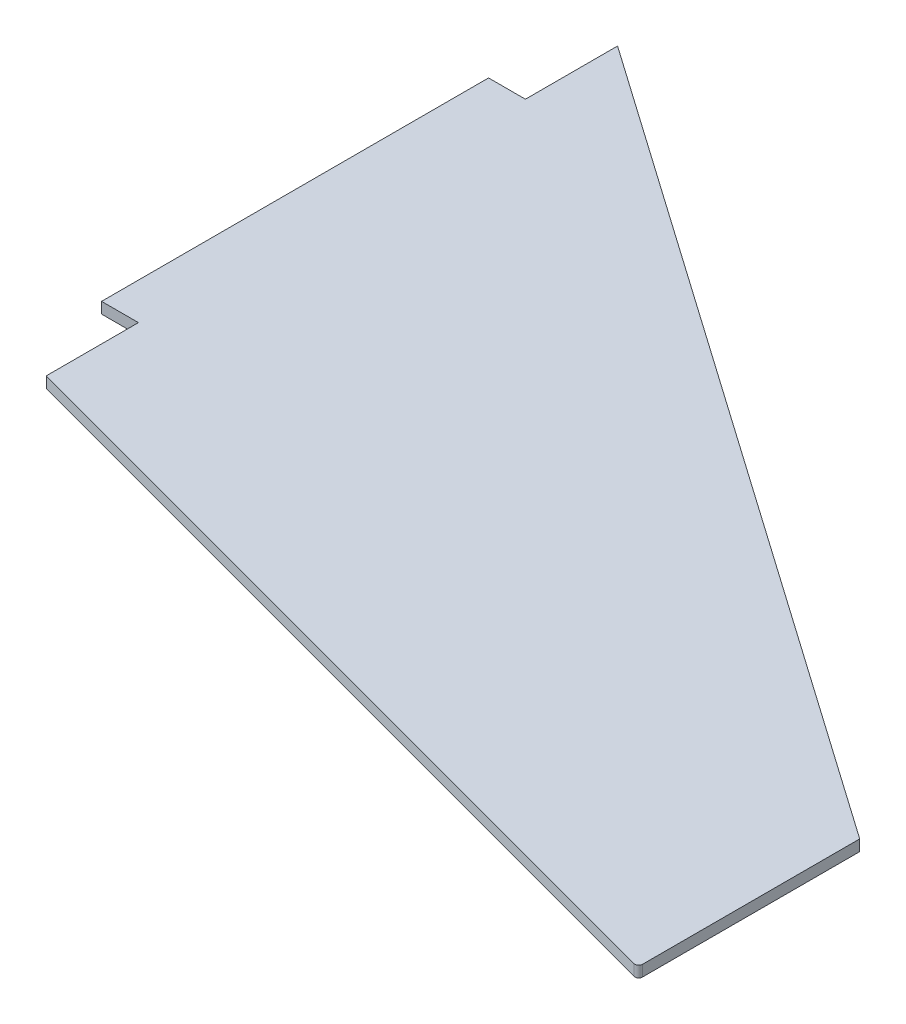
ISO-10303-21;
HEADER;
FILE_DESCRIPTION(('STEP AP214'),'2;1');
FILE_NAME('part.step','',(''),(''),'','','');
FILE_SCHEMA(('AUTOMOTIVE_DESIGN { 1 0 10303 214 1 1 1 1 }'));
ENDSEC;
DATA;
#1=APPLICATION_CONTEXT('core data for automotive mechanical design processes');
#2=APPLICATION_PROTOCOL_DEFINITION('international standard','automotive_design',2000,#1);
#3=PRODUCT_CONTEXT('',#1,'mechanical');
#4=PRODUCT('Part','Part','',(#3));
#5=PRODUCT_RELATED_PRODUCT_CATEGORY('part','',(#4));
#6=PRODUCT_DEFINITION_FORMATION('','',#4);
#7=PRODUCT_DEFINITION_CONTEXT('part definition',#1,'design');
#8=PRODUCT_DEFINITION('design','',#6,#7);
#9=PRODUCT_DEFINITION_SHAPE('','',#8);
#10=(LENGTH_UNIT() NAMED_UNIT(*) SI_UNIT(.MILLI.,.METRE.));
#11=(NAMED_UNIT(*) PLANE_ANGLE_UNIT() SI_UNIT($,.RADIAN.));
#12=(NAMED_UNIT(*) SI_UNIT($,.STERADIAN.) SOLID_ANGLE_UNIT());
#13=UNCERTAINTY_MEASURE_WITH_UNIT(LENGTH_MEASURE(1.E-05),#10,'distance_accuracy_value','');
#14=(GEOMETRIC_REPRESENTATION_CONTEXT(3) GLOBAL_UNCERTAINTY_ASSIGNED_CONTEXT((#13)) GLOBAL_UNIT_ASSIGNED_CONTEXT((#10,
#11,#12)) REPRESENTATION_CONTEXT('',''));
#15=CARTESIAN_POINT('',(0.,0.,0.));
#16=DIRECTION('',(0.,0.,1.));
#17=DIRECTION('',(1.,0.,0.));
#18=AXIS2_PLACEMENT_3D('',#15,#16,#17);
#19=CARTESIAN_POINT('',(0.,3.,0.));
#20=DIRECTION('',(1.,0.,0.));
#21=DIRECTION('',(0.,0.,-1.));
#22=AXIS2_PLACEMENT_3D('',#19,#20,#21);
#23=PLANE('',#22);
#24=DIRECTION('',(0.,0.,1.));
#25=VECTOR('',#24,1.);
#26=CARTESIAN_POINT('',(0.,0.,0.));
#27=LINE('',#26,#25);
#28=CARTESIAN_POINT('',(0.,0.,-25.));
#29=VERTEX_POINT('',#28);
#30=CARTESIAN_POINT('',(0.,0.,0.));
#31=VERTEX_POINT('',#30);
#32=EDGE_CURVE('E152',#29,#31,#27,.T.);
#33=ORIENTED_EDGE('',*,*,#32,.T.);
#34=DIRECTION('',(0.,-1.,0.));
#35=VECTOR('',#34,1.);
#36=CARTESIAN_POINT('',(0.,3.,0.));
#37=LINE('',#36,#35);
#38=CARTESIAN_POINT('',(0.,3.,0.));
#39=VERTEX_POINT('',#38);
#40=EDGE_CURVE('E11',#39,#31,#37,.T.);
#41=ORIENTED_EDGE('',*,*,#40,.F.);
#42=DIRECTION('',(0.,0.,1.));
#43=VECTOR('',#42,1.);
#44=CARTESIAN_POINT('',(0.,3.,0.));
#45=LINE('',#44,#43);
#46=CARTESIAN_POINT('',(0.,3.,-25.));
#47=VERTEX_POINT('',#46);
#48=EDGE_CURVE('E177',#47,#39,#45,.T.);
#49=ORIENTED_EDGE('',*,*,#48,.F.);
#50=DIRECTION('',(0.,-1.,0.));
#51=VECTOR('',#50,1.);
#52=CARTESIAN_POINT('',(0.,3.,-25.));
#53=LINE('',#52,#51);
#54=EDGE_CURVE('E148',#47,#29,#53,.T.);
#55=ORIENTED_EDGE('',*,*,#54,.T.);
#56=EDGE_LOOP('',(#33,#41,#49,#55));
#57=FACE_BOUND('',#56,.T.);
#58=ADVANCED_FACE('F45',(#57),#23,.F.);
#59=CARTESIAN_POINT('',(0.,3.,0.));
#60=DIRECTION('',(0.,0.,1.));
#61=DIRECTION('',(1.,0.,0.));
#62=AXIS2_PLACEMENT_3D('',#59,#60,#61);
#63=PLANE('',#62);
#64=DIRECTION('',(-1.,0.,0.));
#65=VECTOR('',#64,1.);
#66=CARTESIAN_POINT('',(0.,0.,0.));
#67=LINE('',#66,#65);
#68=CARTESIAN_POINT('',(-10.,0.,0.));
#69=VERTEX_POINT('',#68);
#70=EDGE_CURVE('E156',#31,#69,#67,.T.);
#71=ORIENTED_EDGE('',*,*,#70,.T.);
#72=DIRECTION('',(0.,-1.,0.));
#73=VECTOR('',#72,1.);
#74=CARTESIAN_POINT('',(-10.,3.,0.));
#75=LINE('',#74,#73);
#76=CARTESIAN_POINT('',(-10.,3.,0.));
#77=VERTEX_POINT('',#76);
#78=EDGE_CURVE('E54',#77,#69,#75,.T.);
#79=ORIENTED_EDGE('',*,*,#78,.F.);
#80=DIRECTION('',(-1.,0.,0.));
#81=VECTOR('',#80,1.);
#82=CARTESIAN_POINT('',(0.,3.,0.));
#83=LINE('',#82,#81);
#84=EDGE_CURVE('E108',#39,#77,#83,.T.);
#85=ORIENTED_EDGE('',*,*,#84,.F.);
#86=ORIENTED_EDGE('',*,*,#40,.T.);
#87=EDGE_LOOP('',(#71,#79,#85,#86));
#88=FACE_BOUND('',#87,.T.);
#89=ADVANCED_FACE('F233',(#88),#63,.F.);
#90=CARTESIAN_POINT('',(-10.,3.,0.));
#91=DIRECTION('',(1.,0.,0.));
#92=DIRECTION('',(0.,0.,-1.));
#93=AXIS2_PLACEMENT_3D('',#90,#91,#92);
#94=PLANE('',#93);
#95=DIRECTION('',(0.,0.,1.));
#96=VECTOR('',#95,1.);
#97=CARTESIAN_POINT('',(-10.,0.,0.));
#98=LINE('',#97,#96);
#99=CARTESIAN_POINT('',(-9.99999999999999,0.,105.));
#100=VERTEX_POINT('',#99);
#101=EDGE_CURVE('E159',#69,#100,#98,.T.);
#102=ORIENTED_EDGE('',*,*,#101,.T.);
#103=DIRECTION('',(0.,-1.,0.));
#104=VECTOR('',#103,1.);
#105=CARTESIAN_POINT('',(-9.99999999999999,3.,105.));
#106=LINE('',#105,#104);
#107=CARTESIAN_POINT('',(-9.99999999999999,3.,105.));
#108=VERTEX_POINT('',#107);
#109=EDGE_CURVE('E192',#108,#100,#106,.T.);
#110=ORIENTED_EDGE('',*,*,#109,.F.);
#111=DIRECTION('',(0.,0.,1.));
#112=VECTOR('',#111,1.);
#113=CARTESIAN_POINT('',(-10.,3.,0.));
#114=LINE('',#113,#112);
#115=EDGE_CURVE('E202',#77,#108,#114,.T.);
#116=ORIENTED_EDGE('',*,*,#115,.F.);
#117=ORIENTED_EDGE('',*,*,#78,.T.);
#118=EDGE_LOOP('',(#102,#110,#116,#117));
#119=FACE_BOUND('',#118,.T.);
#120=ADVANCED_FACE('F200',(#119),#94,.F.);
#121=CARTESIAN_POINT('',(0.,3.,105.));
#122=DIRECTION('',(0.,0.,-1.));
#123=DIRECTION('',(-1.,0.,0.));
#124=AXIS2_PLACEMENT_3D('',#121,#122,#123);
#125=PLANE('',#124);
#126=DIRECTION('',(1.,0.,0.));
#127=VECTOR('',#126,1.);
#128=CARTESIAN_POINT('',(0.,0.,105.));
#129=LINE('',#128,#127);
#130=CARTESIAN_POINT('',(0.,0.,105.));
#131=VERTEX_POINT('',#130);
#132=EDGE_CURVE('E162',#100,#131,#129,.T.);
#133=ORIENTED_EDGE('',*,*,#132,.T.);
#134=DIRECTION('',(0.,-1.,0.));
#135=VECTOR('',#134,1.);
#136=CARTESIAN_POINT('',(0.,3.,105.));
#137=LINE('',#136,#135);
#138=CARTESIAN_POINT('',(0.,3.,105.));
#139=VERTEX_POINT('',#138);
#140=EDGE_CURVE('E188',#139,#131,#137,.T.);
#141=ORIENTED_EDGE('',*,*,#140,.F.);
#142=DIRECTION('',(1.,0.,0.));
#143=VECTOR('',#142,1.);
#144=CARTESIAN_POINT('',(0.,3.,105.));
#145=LINE('',#144,#143);
#146=EDGE_CURVE('E219',#108,#139,#145,.T.);
#147=ORIENTED_EDGE('',*,*,#146,.F.);
#148=ORIENTED_EDGE('',*,*,#109,.T.);
#149=EDGE_LOOP('',(#133,#141,#147,#148));
#150=FACE_BOUND('',#149,.T.);
#151=ADVANCED_FACE('F211',(#150),#125,.F.);
#152=CARTESIAN_POINT('',(0.,3.,130.));
#153=DIRECTION('',(1.,0.,0.));
#154=DIRECTION('',(0.,0.,-1.));
#155=AXIS2_PLACEMENT_3D('',#152,#153,#154);
#156=PLANE('',#155);
#157=DIRECTION('',(0.,0.,1.));
#158=VECTOR('',#157,1.);
#159=CARTESIAN_POINT('',(0.,0.,130.));
#160=LINE('',#159,#158);
#161=CARTESIAN_POINT('',(0.,0.,130.));
#162=VERTEX_POINT('',#161);
#163=EDGE_CURVE('E165',#131,#162,#160,.T.);
#164=ORIENTED_EDGE('',*,*,#163,.T.);
#165=DIRECTION('',(0.,-1.,0.));
#166=VECTOR('',#165,1.);
#167=CARTESIAN_POINT('',(0.,3.,130.));
#168=LINE('',#167,#166);
#169=CARTESIAN_POINT('',(0.,3.,130.));
#170=VERTEX_POINT('',#169);
#171=EDGE_CURVE('E184',#170,#162,#168,.T.);
#172=ORIENTED_EDGE('',*,*,#171,.F.);
#173=DIRECTION('',(0.,0.,1.));
#174=VECTOR('',#173,1.);
#175=CARTESIAN_POINT('',(0.,3.,130.));
#176=LINE('',#175,#174);
#177=EDGE_CURVE('E217',#139,#170,#176,.T.);
#178=ORIENTED_EDGE('',*,*,#177,.F.);
#179=ORIENTED_EDGE('',*,*,#140,.T.);
#180=EDGE_LOOP('',(#164,#172,#178,#179));
#181=FACE_BOUND('',#180,.T.);
#182=ADVANCED_FACE('F215',(#181),#156,.F.);
#183=CARTESIAN_POINT('',(217.903180954897,3.,188.386981365037));
#184=DIRECTION('',(0.258819045102518,0.,-0.965925826289069));
#185=DIRECTION('',(-0.965925826289069,0.,-0.258819045102518));
#186=AXIS2_PLACEMENT_3D('',#183,#184,#185);
#187=PLANE('',#186);
#188=DIRECTION('',(0.965925826289069,0.,0.258819045102518));
#189=VECTOR('',#188,1.);
#190=CARTESIAN_POINT('',(217.903180954897,0.,188.386981365037));
#191=LINE('',#190,#189);
#192=CARTESIAN_POINT('',(217.903180954897,0.,188.386981365037));
#193=VERTEX_POINT('',#192);
#194=EDGE_CURVE('E168',#162,#193,#191,.T.);
#195=ORIENTED_EDGE('',*,*,#194,.T.);
#196=DIRECTION('',(0.,-1.,0.));
#197=VECTOR('',#196,1.);
#198=CARTESIAN_POINT('',(217.903180954897,3.,188.386981365037));
#199=LINE('',#198,#197);
#200=CARTESIAN_POINT('',(217.903180954897,3.,188.386981365037));
#201=VERTEX_POINT('',#200);
#202=EDGE_CURVE('E141',#201,#193,#199,.T.);
#203=ORIENTED_EDGE('',*,*,#202,.F.);
#204=DIRECTION('',(0.965925826289069,0.,0.258819045102518));
#205=VECTOR('',#204,1.);
#206=CARTESIAN_POINT('',(217.903180954897,3.,188.386981365037));
#207=LINE('',#206,#205);
#208=EDGE_CURVE('E130',#170,#201,#207,.T.);
#209=ORIENTED_EDGE('',*,*,#208,.F.);
#210=ORIENTED_EDGE('',*,*,#171,.T.);
#211=EDGE_LOOP('',(#195,#203,#209,#210));
#212=FACE_BOUND('',#211,.T.);
#213=ADVANCED_FACE('F245',(#212),#187,.F.);
#214=CARTESIAN_POINT('',(218.162,3.,187.421055538748));
#215=DIRECTION('',(0.,-1.,0.));
#216=DIRECTION('',(0.,0.,-1.));
#217=AXIS2_PLACEMENT_3D('',#214,#215,#216);
#218=CYLINDRICAL_SURFACE('',#217,1.00000000000002);
#219=CARTESIAN_POINT('',(218.162,0.,187.421055538748));
#220=DIRECTION('',(0.,1.,0.));
#221=DIRECTION('',(0.,0.,-1.));
#222=AXIS2_PLACEMENT_3D('',#219,#220,#221);
#223=CIRCLE('',#222,1.00000000000002);
#224=CARTESIAN_POINT('',(219.162,0.,187.421055538748));
#225=VERTEX_POINT('',#224);
#226=EDGE_CURVE('E139',#193,#225,#223,.T.);
#227=ORIENTED_EDGE('',*,*,#226,.T.);
#228=DIRECTION('',(0.,-1.,0.));
#229=VECTOR('',#228,1.);
#230=CARTESIAN_POINT('',(219.162,3.,187.421055538748));
#231=LINE('',#230,#229);
#232=CARTESIAN_POINT('',(219.162,3.,187.421055538748));
#233=VERTEX_POINT('',#232);
#234=EDGE_CURVE('E136',#233,#225,#231,.T.);
#235=ORIENTED_EDGE('',*,*,#234,.F.);
#236=CARTESIAN_POINT('',(218.162,3.,187.421055538748));
#237=DIRECTION('',(0.,1.,0.));
#238=DIRECTION('',(0.,0.,-1.));
#239=AXIS2_PLACEMENT_3D('',#236,#237,#238);
#240=CIRCLE('',#239,1.00000000000002);
#241=EDGE_CURVE('E124',#201,#233,#240,.T.);
#242=ORIENTED_EDGE('',*,*,#241,.F.);
#243=ORIENTED_EDGE('',*,*,#202,.T.);
#244=EDGE_LOOP('',(#227,#235,#242,#243));
#245=FACE_BOUND('',#244,.T.);
#246=ADVANCED_FACE('F137',(#245),#218,.T.);
#247=CARTESIAN_POINT('',(219.162,3.,187.421055538748));
#248=DIRECTION('',(-1.,0.,0.));
#249=DIRECTION('',(0.,0.,1.));
#250=AXIS2_PLACEMENT_3D('',#247,#248,#249);
#251=PLANE('',#250);
#252=DIRECTION('',(0.,0.,-1.));
#253=VECTOR('',#252,1.);
#254=CARTESIAN_POINT('',(219.162,0.,187.421055538748));
#255=LINE('',#254,#253);
#256=CARTESIAN_POINT('',(219.162,0.,128.458884489115));
#257=VERTEX_POINT('',#256);
#258=EDGE_CURVE('E94',#225,#257,#255,.T.);
#259=ORIENTED_EDGE('',*,*,#258,.T.);
#260=DIRECTION('',(0.,-1.,0.));
#261=VECTOR('',#260,1.);
#262=CARTESIAN_POINT('',(219.162,3.,128.458884489115));
#263=LINE('',#262,#261);
#264=CARTESIAN_POINT('',(219.162,3.,128.458884489115));
#265=VERTEX_POINT('',#264);
#266=EDGE_CURVE('E142',#265,#257,#263,.T.);
#267=ORIENTED_EDGE('',*,*,#266,.F.);
#268=DIRECTION('',(0.,0.,-1.));
#269=VECTOR('',#268,1.);
#270=CARTESIAN_POINT('',(219.162,3.,187.421055538748));
#271=LINE('',#270,#269);
#272=EDGE_CURVE('E128',#233,#265,#271,.T.);
#273=ORIENTED_EDGE('',*,*,#272,.F.);
#274=ORIENTED_EDGE('',*,*,#234,.T.);
#275=EDGE_LOOP('',(#259,#267,#273,#274));
#276=FACE_BOUND('',#275,.T.);
#277=ADVANCED_FACE('F144',(#276),#251,.F.);
#278=CARTESIAN_POINT('',(219.162,3.,128.458884489115));
#279=DIRECTION('',(-0.573576436351041,0.,0.819152044288995));
#280=DIRECTION('',(0.819152044288995,0.,0.573576436351041));
#281=AXIS2_PLACEMENT_3D('',#278,#279,#280);
#282=PLANE('',#281);
#283=DIRECTION('',(-0.819152044288995,0.,-0.573576436351041));
#284=VECTOR('',#283,1.);
#285=CARTESIAN_POINT('',(219.162,0.,128.458884489115));
#286=LINE('',#285,#284);
#287=EDGE_CURVE('E100',#257,#29,#286,.T.);
#288=ORIENTED_EDGE('',*,*,#287,.T.);
#289=ORIENTED_EDGE('',*,*,#54,.F.);
#290=DIRECTION('',(-0.819152044288995,0.,-0.573576436351041));
#291=VECTOR('',#290,1.);
#292=CARTESIAN_POINT('',(219.162,3.,128.458884489115));
#293=LINE('',#292,#291);
#294=EDGE_CURVE('E62',#265,#47,#293,.T.);
#295=ORIENTED_EDGE('',*,*,#294,.F.);
#296=ORIENTED_EDGE('',*,*,#266,.T.);
#297=EDGE_LOOP('',(#288,#289,#295,#296));
#298=FACE_BOUND('',#297,.T.);
#299=ADVANCED_FACE('F253',(#298),#282,.F.);
#300=CARTESIAN_POINT('',(218.162,3.,187.421055538748));
#301=DIRECTION('',(0.,-1.,0.));
#302=DIRECTION('',(0.,0.,-1.));
#303=AXIS2_PLACEMENT_3D('',#300,#301,#302);
#304=PLANE('',#303);
#305=ORIENTED_EDGE('',*,*,#48,.T.);
#306=ORIENTED_EDGE('',*,*,#84,.T.);
#307=ORIENTED_EDGE('',*,*,#115,.T.);
#308=ORIENTED_EDGE('',*,*,#146,.T.);
#309=ORIENTED_EDGE('',*,*,#177,.T.);
#310=ORIENTED_EDGE('',*,*,#208,.T.);
#311=ORIENTED_EDGE('',*,*,#241,.T.);
#312=ORIENTED_EDGE('',*,*,#272,.T.);
#313=ORIENTED_EDGE('',*,*,#294,.T.);
#314=EDGE_LOOP('',(#305,#306,#307,#308,#309,#310,#311,#312,#313));
#315=FACE_BOUND('',#314,.T.);
#316=ADVANCED_FACE('F126',(#315),#304,.F.);
#317=CARTESIAN_POINT('',(218.162,0.,187.421055538748));
#318=DIRECTION('',(0.,-1.,0.));
#319=DIRECTION('',(0.,0.,-1.));
#320=AXIS2_PLACEMENT_3D('',#317,#318,#319);
#321=PLANE('',#320);
#322=ORIENTED_EDGE('',*,*,#32,.F.);
#323=ORIENTED_EDGE('',*,*,#287,.F.);
#324=ORIENTED_EDGE('',*,*,#258,.F.);
#325=ORIENTED_EDGE('',*,*,#226,.F.);
#326=ORIENTED_EDGE('',*,*,#194,.F.);
#327=ORIENTED_EDGE('',*,*,#163,.F.);
#328=ORIENTED_EDGE('',*,*,#132,.F.);
#329=ORIENTED_EDGE('',*,*,#101,.F.);
#330=ORIENTED_EDGE('',*,*,#70,.F.);
#331=EDGE_LOOP('',(#322,#323,#324,#325,#326,#327,#328,#329,#330));
#332=FACE_BOUND('',#331,.T.);
#333=ADVANCED_FACE('F206',(#332),#321,.T.);
#334=CLOSED_SHELL('',(#58,#89,#120,#151,#182,#213,#246,#277,#299,#316,#333));
#335=MANIFOLD_SOLID_BREP('B2',#334);
#336=ADVANCED_BREP_SHAPE_REPRESENTATION('',(#18,#335),#14);
#337=SHAPE_DEFINITION_REPRESENTATION(#9,#336);
ENDSEC;
END-ISO-10303-21;
